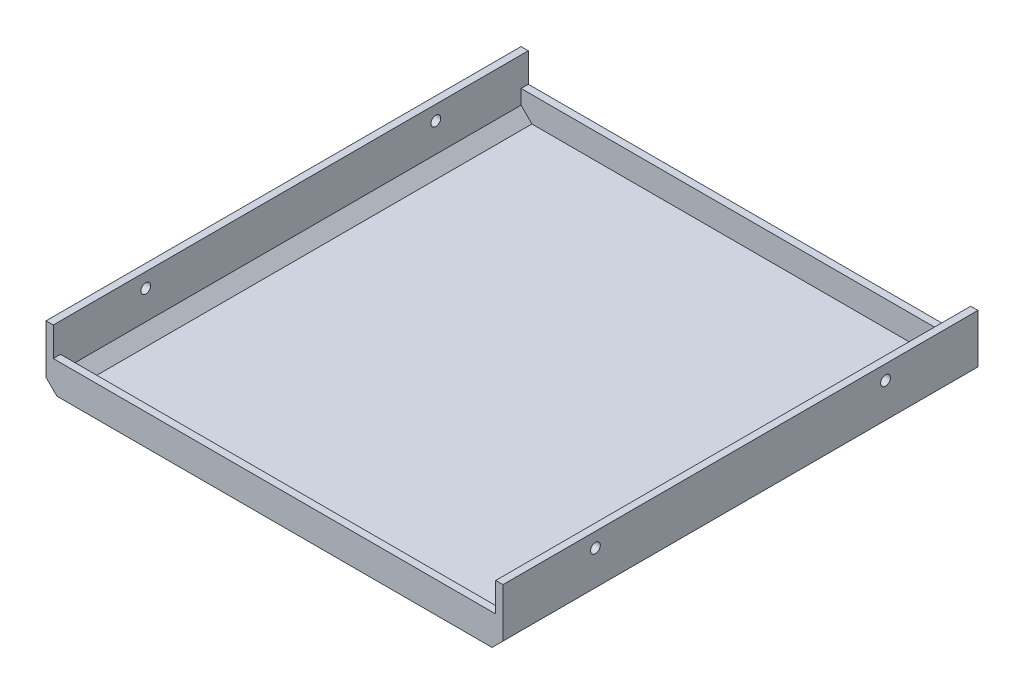
ISO-10303-21;
HEADER;
FILE_DESCRIPTION(('STEP AP214'),'2;1');
FILE_NAME('part.step','',(''),(''),'','','');
FILE_SCHEMA(('AUTOMOTIVE_DESIGN { 1 0 10303 214 1 1 1 1 }'));
ENDSEC;
DATA;
#1=APPLICATION_CONTEXT('core data for automotive mechanical design processes');
#2=APPLICATION_PROTOCOL_DEFINITION('international standard','automotive_design',2000,#1);
#3=PRODUCT_CONTEXT('',#1,'mechanical');
#4=PRODUCT('Part','Part','',(#3));
#5=PRODUCT_RELATED_PRODUCT_CATEGORY('part','',(#4));
#6=PRODUCT_DEFINITION_FORMATION('','',#4);
#7=PRODUCT_DEFINITION_CONTEXT('part definition',#1,'design');
#8=PRODUCT_DEFINITION('design','',#6,#7);
#9=PRODUCT_DEFINITION_SHAPE('','',#8);
#10=(LENGTH_UNIT() NAMED_UNIT(*) SI_UNIT(.MILLI.,.METRE.));
#11=(NAMED_UNIT(*) PLANE_ANGLE_UNIT() SI_UNIT($,.RADIAN.));
#12=(NAMED_UNIT(*) SI_UNIT($,.STERADIAN.) SOLID_ANGLE_UNIT());
#13=UNCERTAINTY_MEASURE_WITH_UNIT(LENGTH_MEASURE(1.E-05),#10,'distance_accuracy_value','');
#14=(GEOMETRIC_REPRESENTATION_CONTEXT(3) GLOBAL_UNCERTAINTY_ASSIGNED_CONTEXT((#13)) GLOBAL_UNIT_ASSIGNED_CONTEXT((#10,
#11,#12)) REPRESENTATION_CONTEXT('',''));
#15=CARTESIAN_POINT('',(0.,0.,0.));
#16=DIRECTION('',(0.,0.,1.));
#17=DIRECTION('',(1.,0.,0.));
#18=AXIS2_PLACEMENT_3D('',#15,#16,#17);
#19=CARTESIAN_POINT('',(0.,1.5,0.));
#20=DIRECTION('',(0.,1.,0.));
#21=DIRECTION('',(0.,0.,1.));
#22=AXIS2_PLACEMENT_3D('',#19,#20,#21);
#23=PLANE('',#22);
#24=DIRECTION('',(-1.,0.,0.));
#25=VECTOR('',#24,1.);
#26=CARTESIAN_POINT('',(61.,1.5,62.5));
#27=LINE('',#26,#25);
#28=CARTESIAN_POINT('',(58.,1.5,62.5));
#29=VERTEX_POINT('',#28);
#30=CARTESIAN_POINT('',(-57.9999999999999,1.5,62.5));
#31=VERTEX_POINT('',#30);
#32=EDGE_CURVE('E289',#29,#31,#27,.T.);
#33=ORIENTED_EDGE('',*,*,#32,.F.);
#34=DIRECTION('',(0.,0.,-1.));
#35=VECTOR('',#34,1.);
#36=CARTESIAN_POINT('',(58.,1.5,0.));
#37=LINE('',#36,#35);
#38=CARTESIAN_POINT('',(58.,1.5,-64.5));
#39=VERTEX_POINT('',#38);
#40=EDGE_CURVE('E59',#29,#39,#37,.T.);
#41=ORIENTED_EDGE('',*,*,#40,.T.);
#42=DIRECTION('',(1.,0.,0.));
#43=VECTOR('',#42,1.);
#44=CARTESIAN_POINT('',(-60.9999999999999,1.5,-64.5));
#45=LINE('',#44,#43);
#46=CARTESIAN_POINT('',(-57.9999999999999,1.5,-64.5));
#47=VERTEX_POINT('',#46);
#48=EDGE_CURVE('E171',#47,#39,#45,.T.);
#49=ORIENTED_EDGE('',*,*,#48,.F.);
#50=DIRECTION('',(0.,0.,1.));
#51=VECTOR('',#50,1.);
#52=CARTESIAN_POINT('',(-57.9999999999999,1.5,0.));
#53=LINE('',#52,#51);
#54=EDGE_CURVE('E276',#47,#31,#53,.T.);
#55=ORIENTED_EDGE('',*,*,#54,.T.);
#56=EDGE_LOOP('',(#33,#41,#49,#55));
#57=FACE_BOUND('',#56,.T.);
#58=ADVANCED_FACE('F36',(#57),#23,.T.);
#59=CARTESIAN_POINT('',(-60.9999999999999,16.5,-66.5));
#60=DIRECTION('',(-1.,0.,0.));
#61=DIRECTION('',(0.,0.,1.));
#62=AXIS2_PLACEMENT_3D('',#59,#60,#61);
#63=PLANE('',#62);
#64=CARTESIAN_POINT('',(-60.9999999999999,12.5,-41.));
#65=DIRECTION('',(-1.,0.,0.));
#66=DIRECTION('',(0.,0.,1.));
#67=AXIS2_PLACEMENT_3D('',#64,#65,#66);
#68=CIRCLE('',#67,1.35000000000001);
#69=CARTESIAN_POINT('',(-60.9999999999999,12.5,-39.65));
#70=VERTEX_POINT('',#69);
#71=EDGE_CURVE('E196',#70,#70,#68,.T.);
#72=ORIENTED_EDGE('',*,*,#71,.T.);
#73=EDGE_LOOP('',(#72));
#74=FACE_BOUND('',#73,.T.);
#75=CARTESIAN_POINT('',(-60.9999999999999,12.5,39.));
#76=DIRECTION('',(-1.,0.,0.));
#77=DIRECTION('',(0.,0.,1.));
#78=AXIS2_PLACEMENT_3D('',#75,#76,#77);
#79=CIRCLE('',#78,1.35000000000001);
#80=CARTESIAN_POINT('',(-60.9999999999999,12.5,40.35));
#81=VERTEX_POINT('',#80);
#82=EDGE_CURVE('E192',#81,#81,#79,.T.);
#83=ORIENTED_EDGE('',*,*,#82,.T.);
#84=EDGE_LOOP('',(#83));
#85=FACE_BOUND('',#84,.T.);
#86=DIRECTION('',(0.,-1.,0.));
#87=VECTOR('',#86,1.);
#88=CARTESIAN_POINT('',(-60.9999999999999,8.5,62.5));
#89=LINE('',#88,#87);
#90=CARTESIAN_POINT('',(-60.9999999999999,8.5,62.5));
#91=VERTEX_POINT('',#90);
#92=CARTESIAN_POINT('',(-60.9999999999999,4.50000000000003,62.5));
#93=VERTEX_POINT('',#92);
#94=EDGE_CURVE('E302',#91,#93,#89,.T.);
#95=ORIENTED_EDGE('',*,*,#94,.T.);
#96=DIRECTION('',(0.,0.,-1.));
#97=VECTOR('',#96,1.);
#98=CARTESIAN_POINT('',(-60.9999999999999,4.50000000000003,-66.5));
#99=LINE('',#98,#97);
#100=CARTESIAN_POINT('',(-60.9999999999999,4.50000000000003,-64.5));
#101=VERTEX_POINT('',#100);
#102=EDGE_CURVE('E11',#93,#101,#99,.T.);
#103=ORIENTED_EDGE('',*,*,#102,.T.);
#104=DIRECTION('',(0.,-1.,0.));
#105=VECTOR('',#104,1.);
#106=CARTESIAN_POINT('',(-60.9999999999999,8.5,-64.5));
#107=LINE('',#106,#105);
#108=CARTESIAN_POINT('',(-60.9999999999999,8.5,-64.5));
#109=VERTEX_POINT('',#108);
#110=EDGE_CURVE('E156',#109,#101,#107,.T.);
#111=ORIENTED_EDGE('',*,*,#110,.F.);
#112=DIRECTION('',(0.,0.,1.));
#113=VECTOR('',#112,1.);
#114=CARTESIAN_POINT('',(-60.9999999999999,8.5,-66.5));
#115=LINE('',#114,#113);
#116=CARTESIAN_POINT('',(-60.9999999999999,8.5,-66.5));
#117=VERTEX_POINT('',#116);
#118=EDGE_CURVE('E162',#117,#109,#115,.T.);
#119=ORIENTED_EDGE('',*,*,#118,.F.);
#120=DIRECTION('',(0.,-1.,0.));
#121=VECTOR('',#120,1.);
#122=CARTESIAN_POINT('',(-60.9999999999999,16.5,-66.5));
#123=LINE('',#122,#121);
#124=CARTESIAN_POINT('',(-60.9999999999999,16.5,-66.5));
#125=VERTEX_POINT('',#124);
#126=EDGE_CURVE('E225',#125,#117,#123,.T.);
#127=ORIENTED_EDGE('',*,*,#126,.F.);
#128=DIRECTION('',(0.,0.,-1.));
#129=VECTOR('',#128,1.);
#130=CARTESIAN_POINT('',(-60.9999999999999,16.5,-66.5));
#131=LINE('',#130,#129);
#132=CARTESIAN_POINT('',(-60.9999999999999,16.5,64.5));
#133=VERTEX_POINT('',#132);
#134=EDGE_CURVE('E220',#133,#125,#131,.T.);
#135=ORIENTED_EDGE('',*,*,#134,.F.);
#136=DIRECTION('',(0.,-1.,0.));
#137=VECTOR('',#136,1.);
#138=CARTESIAN_POINT('',(-60.9999999999999,16.5,64.5));
#139=LINE('',#138,#137);
#140=CARTESIAN_POINT('',(-60.9999999999999,8.5,64.5));
#141=VERTEX_POINT('',#140);
#142=EDGE_CURVE('E227',#133,#141,#139,.T.);
#143=ORIENTED_EDGE('',*,*,#142,.T.);
#144=DIRECTION('',(0.,0.,1.));
#145=VECTOR('',#144,1.);
#146=CARTESIAN_POINT('',(-60.9999999999999,8.5,64.5));
#147=LINE('',#146,#145);
#148=EDGE_CURVE('E344',#91,#141,#147,.T.);
#149=ORIENTED_EDGE('',*,*,#148,.F.);
#150=EDGE_LOOP('',(#95,#103,#111,#119,#127,#135,#143,#149));
#151=FACE_BOUND('',#150,.T.);
#152=ADVANCED_FACE('F174',(#74,#85,#151),#63,.F.);
#153=CARTESIAN_POINT('',(61.,16.5,64.5));
#154=DIRECTION('',(1.,0.,0.));
#155=DIRECTION('',(0.,0.,-1.));
#156=AXIS2_PLACEMENT_3D('',#153,#154,#155);
#157=PLANE('',#156);
#158=CARTESIAN_POINT('',(61.,12.5,-41.));
#159=DIRECTION('',(1.,0.,0.));
#160=DIRECTION('',(0.,0.,-1.));
#161=AXIS2_PLACEMENT_3D('',#158,#159,#160);
#162=CIRCLE('',#161,1.35000000000001);
#163=CARTESIAN_POINT('',(61.,12.5,-42.35));
#164=VERTEX_POINT('',#163);
#165=EDGE_CURVE('E195',#164,#164,#162,.T.);
#166=ORIENTED_EDGE('',*,*,#165,.T.);
#167=EDGE_LOOP('',(#166));
#168=FACE_BOUND('',#167,.T.);
#169=CARTESIAN_POINT('',(61.,12.5,39.));
#170=DIRECTION('',(1.,0.,0.));
#171=DIRECTION('',(0.,0.,-1.));
#172=AXIS2_PLACEMENT_3D('',#169,#170,#171);
#173=CIRCLE('',#172,1.35000000000001);
#174=CARTESIAN_POINT('',(61.,12.5,37.65));
#175=VERTEX_POINT('',#174);
#176=EDGE_CURVE('E188',#175,#175,#173,.T.);
#177=ORIENTED_EDGE('',*,*,#176,.T.);
#178=EDGE_LOOP('',(#177));
#179=FACE_BOUND('',#178,.T.);
#180=DIRECTION('',(0.,-1.,0.));
#181=VECTOR('',#180,1.);
#182=CARTESIAN_POINT('',(61.,8.5,-64.5));
#183=LINE('',#182,#181);
#184=CARTESIAN_POINT('',(61.,8.5,-64.5));
#185=VERTEX_POINT('',#184);
#186=CARTESIAN_POINT('',(61.,4.50000000000003,-64.5));
#187=VERTEX_POINT('',#186);
#188=EDGE_CURVE('E158',#185,#187,#183,.T.);
#189=ORIENTED_EDGE('',*,*,#188,.T.);
#190=DIRECTION('',(0.,0.,1.));
#191=VECTOR('',#190,1.);
#192=CARTESIAN_POINT('',(61.,4.50000000000003,64.5));
#193=LINE('',#192,#191);
#194=CARTESIAN_POINT('',(61.,4.50000000000003,62.5));
#195=VERTEX_POINT('',#194);
#196=EDGE_CURVE('E269',#187,#195,#193,.T.);
#197=ORIENTED_EDGE('',*,*,#196,.T.);
#198=DIRECTION('',(0.,-1.,0.));
#199=VECTOR('',#198,1.);
#200=CARTESIAN_POINT('',(61.,8.5,62.5));
#201=LINE('',#200,#199);
#202=CARTESIAN_POINT('',(61.,8.5,62.5));
#203=VERTEX_POINT('',#202);
#204=EDGE_CURVE('E292',#203,#195,#201,.T.);
#205=ORIENTED_EDGE('',*,*,#204,.F.);
#206=DIRECTION('',(0.,0.,-1.));
#207=VECTOR('',#206,1.);
#208=CARTESIAN_POINT('',(61.,8.5,64.5));
#209=LINE('',#208,#207);
#210=CARTESIAN_POINT('',(61.,8.5,64.5));
#211=VERTEX_POINT('',#210);
#212=EDGE_CURVE('E293',#211,#203,#209,.T.);
#213=ORIENTED_EDGE('',*,*,#212,.F.);
#214=DIRECTION('',(0.,-1.,0.));
#215=VECTOR('',#214,1.);
#216=CARTESIAN_POINT('',(61.,16.5,64.5));
#217=LINE('',#216,#215);
#218=CARTESIAN_POINT('',(61.,16.5,64.5));
#219=VERTEX_POINT('',#218);
#220=EDGE_CURVE('E209',#219,#211,#217,.T.);
#221=ORIENTED_EDGE('',*,*,#220,.F.);
#222=DIRECTION('',(0.,0.,1.));
#223=VECTOR('',#222,1.);
#224=CARTESIAN_POINT('',(61.,16.5,64.5));
#225=LINE('',#224,#223);
#226=CARTESIAN_POINT('',(61.,16.5,-66.5));
#227=VERTEX_POINT('',#226);
#228=EDGE_CURVE('E204',#227,#219,#225,.T.);
#229=ORIENTED_EDGE('',*,*,#228,.F.);
#230=DIRECTION('',(0.,-1.,0.));
#231=VECTOR('',#230,1.);
#232=CARTESIAN_POINT('',(61.,16.5,-66.5));
#233=LINE('',#232,#231);
#234=CARTESIAN_POINT('',(61.,8.5,-66.5));
#235=VERTEX_POINT('',#234);
#236=EDGE_CURVE('E212',#227,#235,#233,.T.);
#237=ORIENTED_EDGE('',*,*,#236,.T.);
#238=DIRECTION('',(0.,0.,-1.));
#239=VECTOR('',#238,1.);
#240=CARTESIAN_POINT('',(61.,8.5,-66.5));
#241=LINE('',#240,#239);
#242=EDGE_CURVE('E161',#185,#235,#241,.T.);
#243=ORIENTED_EDGE('',*,*,#242,.F.);
#244=EDGE_LOOP('',(#189,#197,#205,#213,#221,#229,#237,#243));
#245=FACE_BOUND('',#244,.T.);
#246=ADVANCED_FACE('F283',(#168,#179,#245),#157,.F.);
#247=CARTESIAN_POINT('',(-62.9999999999999,1.5,-66.5));
#248=DIRECTION('',(1.,0.,0.));
#249=DIRECTION('',(0.,0.,-1.));
#250=AXIS2_PLACEMENT_3D('',#247,#248,#249);
#251=PLANE('',#250);
#252=CARTESIAN_POINT('',(-62.9999999999999,12.5,-41.));
#253=DIRECTION('',(-1.,0.,0.));
#254=DIRECTION('',(0.,0.,1.));
#255=AXIS2_PLACEMENT_3D('',#252,#253,#254);
#256=CIRCLE('',#255,1.35000000000001);
#257=CARTESIAN_POINT('',(-62.9999999999999,12.5,-39.65));
#258=VERTEX_POINT('',#257);
#259=EDGE_CURVE('E183',#258,#258,#256,.T.);
#260=ORIENTED_EDGE('',*,*,#259,.F.);
#261=EDGE_LOOP('',(#260));
#262=FACE_BOUND('',#261,.T.);
#263=CARTESIAN_POINT('',(-62.9999999999999,12.5,39.));
#264=DIRECTION('',(-1.,0.,0.));
#265=DIRECTION('',(0.,0.,-1.));
#266=AXIS2_PLACEMENT_3D('',#263,#264,#265);
#267=CIRCLE('',#266,1.35000000000001);
#268=CARTESIAN_POINT('',(-62.9999999999999,12.5,37.65));
#269=VERTEX_POINT('',#268);
#270=EDGE_CURVE('E175',#269,#269,#267,.T.);
#271=ORIENTED_EDGE('',*,*,#270,.F.);
#272=EDGE_LOOP('',(#271));
#273=FACE_BOUND('',#272,.T.);
#274=DIRECTION('',(0.,-1.,0.));
#275=VECTOR('',#274,1.);
#276=CARTESIAN_POINT('',(-62.9999999999999,1.5,-66.5));
#277=LINE('',#276,#275);
#278=CARTESIAN_POINT('',(-62.9999999999999,16.5,-66.5));
#279=VERTEX_POINT('',#278);
#280=CARTESIAN_POINT('',(-62.9999999999999,3.,-66.5));
#281=VERTEX_POINT('',#280);
#282=EDGE_CURVE('E235',#279,#281,#277,.T.);
#283=ORIENTED_EDGE('',*,*,#282,.T.);
#284=DIRECTION('',(0.,0.,1.));
#285=VECTOR('',#284,1.);
#286=CARTESIAN_POINT('',(-62.9999999999999,3.,-66.5));
#287=LINE('',#286,#285);
#288=CARTESIAN_POINT('',(-62.9999999999999,3.,64.5));
#289=VERTEX_POINT('',#288);
#290=EDGE_CURVE('E247',#281,#289,#287,.T.);
#291=ORIENTED_EDGE('',*,*,#290,.T.);
#292=DIRECTION('',(0.,-1.,0.));
#293=VECTOR('',#292,1.);
#294=CARTESIAN_POINT('',(-62.9999999999999,1.5,64.5));
#295=LINE('',#294,#293);
#296=CARTESIAN_POINT('',(-62.9999999999999,16.5,64.5));
#297=VERTEX_POINT('',#296);
#298=EDGE_CURVE('E244',#297,#289,#295,.T.);
#299=ORIENTED_EDGE('',*,*,#298,.F.);
#300=DIRECTION('',(0.,0.,1.));
#301=VECTOR('',#300,1.);
#302=CARTESIAN_POINT('',(-62.9999999999999,16.5,-66.5));
#303=LINE('',#302,#301);
#304=EDGE_CURVE('E215',#279,#297,#303,.T.);
#305=ORIENTED_EDGE('',*,*,#304,.F.);
#306=EDGE_LOOP('',(#283,#291,#299,#305));
#307=FACE_BOUND('',#306,.T.);
#308=ADVANCED_FACE('F337',(#262,#273,#307),#251,.F.);
#309=CARTESIAN_POINT('',(-62.9999999999999,1.5,64.5));
#310=DIRECTION('',(0.,0.,-1.));
#311=DIRECTION('',(-1.,0.,0.));
#312=AXIS2_PLACEMENT_3D('',#309,#310,#311);
#313=PLANE('',#312);
#314=ORIENTED_EDGE('',*,*,#298,.T.);
#315=DIRECTION('',(-0.707106781186548,0.707106781186548,0.));
#316=VECTOR('',#315,1.);
#317=CARTESIAN_POINT('',(-62.9999999999999,3.00000000000002,64.5));
#318=LINE('',#317,#316);
#319=CARTESIAN_POINT('',(-59.9999999999999,0.,64.5));
#320=VERTEX_POINT('',#319);
#321=EDGE_CURVE('E256',#289,#320,#318,.F.);
#322=ORIENTED_EDGE('',*,*,#321,.T.);
#323=DIRECTION('',(1.,0.,0.));
#324=VECTOR('',#323,1.);
#325=CARTESIAN_POINT('',(-62.9999999999999,0.,64.5));
#326=LINE('',#325,#324);
#327=CARTESIAN_POINT('',(60.,0.,64.5));
#328=VERTEX_POINT('',#327);
#329=EDGE_CURVE('E229',#320,#328,#326,.T.);
#330=ORIENTED_EDGE('',*,*,#329,.T.);
#331=DIRECTION('',(-0.707106781186548,-0.707106781186548,0.));
#332=VECTOR('',#331,1.);
#333=CARTESIAN_POINT('',(63.,3.,64.5));
#334=LINE('',#333,#332);
#335=CARTESIAN_POINT('',(63.,3.,64.5));
#336=VERTEX_POINT('',#335);
#337=EDGE_CURVE('E254',#328,#336,#334,.F.);
#338=ORIENTED_EDGE('',*,*,#337,.T.);
#339=DIRECTION('',(0.,-1.,0.));
#340=VECTOR('',#339,1.);
#341=CARTESIAN_POINT('',(63.,1.5,64.5));
#342=LINE('',#341,#340);
#343=CARTESIAN_POINT('',(63.,16.5,64.5));
#344=VERTEX_POINT('',#343);
#345=EDGE_CURVE('E241',#344,#336,#342,.T.);
#346=ORIENTED_EDGE('',*,*,#345,.F.);
#347=DIRECTION('',(1.,0.,0.));
#348=VECTOR('',#347,1.);
#349=CARTESIAN_POINT('',(63.,16.5,64.5));
#350=LINE('',#349,#348);
#351=EDGE_CURVE('E206',#219,#344,#350,.T.);
#352=ORIENTED_EDGE('',*,*,#351,.F.);
#353=ORIENTED_EDGE('',*,*,#220,.T.);
#354=DIRECTION('',(1.,0.,0.));
#355=VECTOR('',#354,1.);
#356=CARTESIAN_POINT('',(61.,8.5,64.5));
#357=LINE('',#356,#355);
#358=EDGE_CURVE('E300',#141,#211,#357,.T.);
#359=ORIENTED_EDGE('',*,*,#358,.F.);
#360=ORIENTED_EDGE('',*,*,#142,.F.);
#361=DIRECTION('',(1.,0.,0.));
#362=VECTOR('',#361,1.);
#363=CARTESIAN_POINT('',(-62.9999999999999,16.5,64.5));
#364=LINE('',#363,#362);
#365=EDGE_CURVE('E218',#297,#133,#364,.T.);
#366=ORIENTED_EDGE('',*,*,#365,.F.);
#367=EDGE_LOOP('',(#314,#322,#330,#338,#346,#352,#353,#359,#360,#366));
#368=FACE_BOUND('',#367,.T.);
#369=ADVANCED_FACE('F330',(#368),#313,.F.);
#370=CARTESIAN_POINT('',(63.,1.5,-66.5));
#371=DIRECTION('',(-1.,0.,0.));
#372=DIRECTION('',(0.,0.,1.));
#373=AXIS2_PLACEMENT_3D('',#370,#371,#372);
#374=PLANE('',#373);
#375=CARTESIAN_POINT('',(63.,12.5,-41.));
#376=DIRECTION('',(-1.,0.,0.));
#377=DIRECTION('',(0.,0.,1.));
#378=AXIS2_PLACEMENT_3D('',#375,#376,#377);
#379=CIRCLE('',#378,1.35000000000001);
#380=CARTESIAN_POINT('',(63.,12.5,-39.65));
#381=VERTEX_POINT('',#380);
#382=EDGE_CURVE('E186',#381,#381,#379,.F.);
#383=ORIENTED_EDGE('',*,*,#382,.F.);
#384=EDGE_LOOP('',(#383));
#385=FACE_BOUND('',#384,.T.);
#386=CARTESIAN_POINT('',(63.,12.5,39.));
#387=DIRECTION('',(-1.,0.,0.));
#388=DIRECTION('',(0.,0.,1.));
#389=AXIS2_PLACEMENT_3D('',#386,#387,#388);
#390=CIRCLE('',#389,1.35000000000001);
#391=CARTESIAN_POINT('',(63.,12.5,40.35));
#392=VERTEX_POINT('',#391);
#393=EDGE_CURVE('E178',#392,#392,#390,.F.);
#394=ORIENTED_EDGE('',*,*,#393,.F.);
#395=EDGE_LOOP('',(#394));
#396=FACE_BOUND('',#395,.T.);
#397=ORIENTED_EDGE('',*,*,#345,.T.);
#398=DIRECTION('',(0.,0.,-1.));
#399=VECTOR('',#398,1.);
#400=CARTESIAN_POINT('',(63.,3.,-66.5));
#401=LINE('',#400,#399);
#402=CARTESIAN_POINT('',(63.,3.,-66.5));
#403=VERTEX_POINT('',#402);
#404=EDGE_CURVE('E266',#336,#403,#401,.T.);
#405=ORIENTED_EDGE('',*,*,#404,.T.);
#406=DIRECTION('',(0.,-1.,0.));
#407=VECTOR('',#406,1.);
#408=CARTESIAN_POINT('',(63.,1.5,-66.5));
#409=LINE('',#408,#407);
#410=CARTESIAN_POINT('',(63.,16.5,-66.5));
#411=VERTEX_POINT('',#410);
#412=EDGE_CURVE('E238',#411,#403,#409,.T.);
#413=ORIENTED_EDGE('',*,*,#412,.F.);
#414=DIRECTION('',(0.,0.,-1.));
#415=VECTOR('',#414,1.);
#416=CARTESIAN_POINT('',(63.,16.5,64.5));
#417=LINE('',#416,#415);
#418=EDGE_CURVE('E199',#344,#411,#417,.T.);
#419=ORIENTED_EDGE('',*,*,#418,.F.);
#420=EDGE_LOOP('',(#397,#405,#413,#419));
#421=FACE_BOUND('',#420,.T.);
#422=ADVANCED_FACE('F319',(#385,#396,#421),#374,.F.);
#423=CARTESIAN_POINT('',(-62.9999999999999,1.5,-66.5));
#424=DIRECTION('',(0.,0.,1.));
#425=DIRECTION('',(1.,0.,0.));
#426=AXIS2_PLACEMENT_3D('',#423,#424,#425);
#427=PLANE('',#426);
#428=DIRECTION('',(-1.,0.,0.));
#429=VECTOR('',#428,1.);
#430=CARTESIAN_POINT('',(-62.9999999999999,0.,-66.5));
#431=LINE('',#430,#429);
#432=CARTESIAN_POINT('',(60.,0.,-66.5));
#433=VERTEX_POINT('',#432);
#434=CARTESIAN_POINT('',(-59.9999999999999,0.,-66.5));
#435=VERTEX_POINT('',#434);
#436=EDGE_CURVE('E232',#433,#435,#431,.T.);
#437=ORIENTED_EDGE('',*,*,#436,.T.);
#438=DIRECTION('',(0.707106781186548,-0.707106781186548,0.));
#439=VECTOR('',#438,1.);
#440=CARTESIAN_POINT('',(-62.9999999999999,3.,-66.5));
#441=LINE('',#440,#439);
#442=EDGE_CURVE('E264',#435,#281,#441,.F.);
#443=ORIENTED_EDGE('',*,*,#442,.T.);
#444=ORIENTED_EDGE('',*,*,#282,.F.);
#445=DIRECTION('',(-1.,0.,0.));
#446=VECTOR('',#445,1.);
#447=CARTESIAN_POINT('',(-62.9999999999999,16.5,-66.5));
#448=LINE('',#447,#446);
#449=EDGE_CURVE('E222',#125,#279,#448,.T.);
#450=ORIENTED_EDGE('',*,*,#449,.F.);
#451=ORIENTED_EDGE('',*,*,#126,.T.);
#452=DIRECTION('',(-1.,0.,0.));
#453=VECTOR('',#452,1.);
#454=CARTESIAN_POINT('',(-60.9999999999999,8.5,-66.5));
#455=LINE('',#454,#453);
#456=EDGE_CURVE('E167',#235,#117,#455,.T.);
#457=ORIENTED_EDGE('',*,*,#456,.F.);
#458=ORIENTED_EDGE('',*,*,#236,.F.);
#459=DIRECTION('',(-1.,0.,0.));
#460=VECTOR('',#459,1.);
#461=CARTESIAN_POINT('',(63.,16.5,-66.5));
#462=LINE('',#461,#460);
#463=EDGE_CURVE('E202',#411,#227,#462,.T.);
#464=ORIENTED_EDGE('',*,*,#463,.F.);
#465=ORIENTED_EDGE('',*,*,#412,.T.);
#466=DIRECTION('',(0.707106781186548,0.707106781186548,0.));
#467=VECTOR('',#466,1.);
#468=CARTESIAN_POINT('',(63.,3.,-66.5));
#469=LINE('',#468,#467);
#470=EDGE_CURVE('E262',#403,#433,#469,.F.);
#471=ORIENTED_EDGE('',*,*,#470,.T.);
#472=EDGE_LOOP('',(#437,#443,#444,#450,#451,#457,#458,#464,#465,#471));
#473=FACE_BOUND('',#472,.T.);
#474=ADVANCED_FACE('F308',(#473),#427,.F.);
#475=CARTESIAN_POINT('',(0.,0.,0.));
#476=DIRECTION('',(0.,1.,0.));
#477=DIRECTION('',(0.,0.,1.));
#478=AXIS2_PLACEMENT_3D('',#475,#476,#477);
#479=PLANE('',#478);
#480=ORIENTED_EDGE('',*,*,#329,.F.);
#481=DIRECTION('',(0.,0.,-1.));
#482=VECTOR('',#481,1.);
#483=CARTESIAN_POINT('',(-59.9999999999999,0.,0.));
#484=LINE('',#483,#482);
#485=EDGE_CURVE('E260',#320,#435,#484,.T.);
#486=ORIENTED_EDGE('',*,*,#485,.T.);
#487=ORIENTED_EDGE('',*,*,#436,.F.);
#488=DIRECTION('',(0.,0.,1.));
#489=VECTOR('',#488,1.);
#490=CARTESIAN_POINT('',(60.,0.,0.));
#491=LINE('',#490,#489);
#492=EDGE_CURVE('E258',#433,#328,#491,.T.);
#493=ORIENTED_EDGE('',*,*,#492,.T.);
#494=EDGE_LOOP('',(#480,#486,#487,#493));
#495=FACE_BOUND('',#494,.T.);
#496=ADVANCED_FACE('F327',(#495),#479,.F.);
#497=CARTESIAN_POINT('',(0.,16.5,0.));
#498=DIRECTION('',(0.,1.,0.));
#499=DIRECTION('',(0.,0.,1.));
#500=AXIS2_PLACEMENT_3D('',#497,#498,#499);
#501=PLANE('',#500);
#502=ORIENTED_EDGE('',*,*,#304,.T.);
#503=ORIENTED_EDGE('',*,*,#365,.T.);
#504=ORIENTED_EDGE('',*,*,#134,.T.);
#505=ORIENTED_EDGE('',*,*,#449,.T.);
#506=EDGE_LOOP('',(#502,#503,#504,#505));
#507=FACE_BOUND('',#506,.T.);
#508=ADVANCED_FACE('F340',(#507),#501,.T.);
#509=CARTESIAN_POINT('',(0.,16.5,0.));
#510=DIRECTION('',(0.,1.,0.));
#511=DIRECTION('',(0.,0.,1.));
#512=AXIS2_PLACEMENT_3D('',#509,#510,#511);
#513=PLANE('',#512);
#514=ORIENTED_EDGE('',*,*,#418,.T.);
#515=ORIENTED_EDGE('',*,*,#463,.T.);
#516=ORIENTED_EDGE('',*,*,#228,.T.);
#517=ORIENTED_EDGE('',*,*,#351,.T.);
#518=EDGE_LOOP('',(#514,#515,#516,#517));
#519=FACE_BOUND('',#518,.T.);
#520=ADVANCED_FACE('F315',(#519),#513,.T.);
#521=CARTESIAN_POINT('',(66.8183766184074,12.5,39.));
#522=DIRECTION('',(-1.,0.,0.));
#523=DIRECTION('',(0.,0.,1.));
#524=AXIS2_PLACEMENT_3D('',#521,#522,#523);
#525=CYLINDRICAL_SURFACE('',#524,1.35000000000001);
#526=ORIENTED_EDGE('',*,*,#393,.T.);
#527=EDGE_LOOP('',(#526));
#528=FACE_BOUND('',#527,.T.);
#529=ORIENTED_EDGE('',*,*,#176,.F.);
#530=EDGE_LOOP('',(#529));
#531=FACE_BOUND('',#530,.T.);
#532=ADVANCED_FACE('F539',(#528,#531),#525,.F.);
#533=CARTESIAN_POINT('',(66.8183766184074,12.5,-41.));
#534=DIRECTION('',(-1.,0.,0.));
#535=DIRECTION('',(0.,0.,1.));
#536=AXIS2_PLACEMENT_3D('',#533,#534,#535);
#537=CYLINDRICAL_SURFACE('',#536,1.35000000000001);
#538=ORIENTED_EDGE('',*,*,#382,.T.);
#539=EDGE_LOOP('',(#538));
#540=FACE_BOUND('',#539,.T.);
#541=ORIENTED_EDGE('',*,*,#165,.F.);
#542=EDGE_LOOP('',(#541));
#543=FACE_BOUND('',#542,.T.);
#544=ADVANCED_FACE('F529',(#540,#543),#537,.F.);
#545=ORIENTED_EDGE('',*,*,#270,.T.);
#546=EDGE_LOOP('',(#545));
#547=FACE_BOUND('',#546,.T.);
#548=ORIENTED_EDGE('',*,*,#82,.F.);
#549=EDGE_LOOP('',(#548));
#550=FACE_BOUND('',#549,.T.);
#551=ADVANCED_FACE('F526',(#547,#550),#525,.F.);
#552=ORIENTED_EDGE('',*,*,#259,.T.);
#553=EDGE_LOOP('',(#552));
#554=FACE_BOUND('',#553,.T.);
#555=ORIENTED_EDGE('',*,*,#71,.F.);
#556=EDGE_LOOP('',(#555));
#557=FACE_BOUND('',#556,.T.);
#558=ADVANCED_FACE('F424',(#554,#557),#537,.F.);
#559=CARTESIAN_POINT('',(-60.9999999999999,8.5,-64.5));
#560=DIRECTION('',(0.,0.,-1.));
#561=DIRECTION('',(-1.,0.,0.));
#562=AXIS2_PLACEMENT_3D('',#559,#560,#561);
#563=PLANE('',#562);
#564=ORIENTED_EDGE('',*,*,#48,.T.);
#565=DIRECTION('',(0.707106781186544,0.707106781186551,0.));
#566=VECTOR('',#565,1.);
#567=CARTESIAN_POINT('',(61.,4.50000000000003,-64.5));
#568=LINE('',#567,#566);
#569=EDGE_CURVE('E45',#39,#187,#568,.T.);
#570=ORIENTED_EDGE('',*,*,#569,.T.);
#571=ORIENTED_EDGE('',*,*,#188,.F.);
#572=DIRECTION('',(1.,0.,0.));
#573=VECTOR('',#572,1.);
#574=CARTESIAN_POINT('',(-60.9999999999999,8.5,-64.5));
#575=LINE('',#574,#573);
#576=EDGE_CURVE('E152',#109,#185,#575,.T.);
#577=ORIENTED_EDGE('',*,*,#576,.F.);
#578=ORIENTED_EDGE('',*,*,#110,.T.);
#579=DIRECTION('',(0.707106781186544,-0.707106781186551,0.));
#580=VECTOR('',#579,1.);
#581=CARTESIAN_POINT('',(-60.9999999999999,4.50000000000003,-64.5));
#582=LINE('',#581,#580);
#583=EDGE_CURVE('E52',#101,#47,#582,.T.);
#584=ORIENTED_EDGE('',*,*,#583,.T.);
#585=EDGE_LOOP('',(#564,#570,#571,#577,#578,#584));
#586=FACE_BOUND('',#585,.T.);
#587=ADVANCED_FACE('F154',(#586),#563,.F.);
#588=CARTESIAN_POINT('',(0.,8.5,0.));
#589=DIRECTION('',(0.,1.,0.));
#590=DIRECTION('',(0.,0.,1.));
#591=AXIS2_PLACEMENT_3D('',#588,#589,#590);
#592=PLANE('',#591);
#593=ORIENTED_EDGE('',*,*,#118,.T.);
#594=ORIENTED_EDGE('',*,*,#576,.T.);
#595=ORIENTED_EDGE('',*,*,#242,.T.);
#596=ORIENTED_EDGE('',*,*,#456,.T.);
#597=EDGE_LOOP('',(#593,#594,#595,#596));
#598=FACE_BOUND('',#597,.T.);
#599=ADVANCED_FACE('F165',(#598),#592,.T.);
#600=CARTESIAN_POINT('',(61.,8.5,62.5));
#601=DIRECTION('',(0.,0.,1.));
#602=DIRECTION('',(1.,0.,0.));
#603=AXIS2_PLACEMENT_3D('',#600,#601,#602);
#604=PLANE('',#603);
#605=ORIENTED_EDGE('',*,*,#204,.T.);
#606=DIRECTION('',(-0.707106781186544,-0.707106781186551,0.));
#607=VECTOR('',#606,1.);
#608=CARTESIAN_POINT('',(61.,4.50000000000003,62.5));
#609=LINE('',#608,#607);
#610=EDGE_CURVE('E274',#195,#29,#609,.T.);
#611=ORIENTED_EDGE('',*,*,#610,.T.);
#612=ORIENTED_EDGE('',*,*,#32,.T.);
#613=DIRECTION('',(-0.707106781186544,0.707106781186551,0.));
#614=VECTOR('',#613,1.);
#615=CARTESIAN_POINT('',(-60.9999999999999,4.50000000000003,62.5));
#616=LINE('',#615,#614);
#617=EDGE_CURVE('E272',#31,#93,#616,.T.);
#618=ORIENTED_EDGE('',*,*,#617,.T.);
#619=ORIENTED_EDGE('',*,*,#94,.F.);
#620=DIRECTION('',(-1.,0.,0.));
#621=VECTOR('',#620,1.);
#622=CARTESIAN_POINT('',(61.,8.5,62.5));
#623=LINE('',#622,#621);
#624=EDGE_CURVE('E296',#203,#91,#623,.T.);
#625=ORIENTED_EDGE('',*,*,#624,.F.);
#626=EDGE_LOOP('',(#605,#611,#612,#618,#619,#625));
#627=FACE_BOUND('',#626,.T.);
#628=ADVANCED_FACE('F288',(#627),#604,.F.);
#629=CARTESIAN_POINT('',(0.,8.5,0.));
#630=DIRECTION('',(0.,1.,0.));
#631=DIRECTION('',(0.,0.,1.));
#632=AXIS2_PLACEMENT_3D('',#629,#630,#631);
#633=PLANE('',#632);
#634=ORIENTED_EDGE('',*,*,#212,.T.);
#635=ORIENTED_EDGE('',*,*,#624,.T.);
#636=ORIENTED_EDGE('',*,*,#148,.T.);
#637=ORIENTED_EDGE('',*,*,#358,.T.);
#638=EDGE_LOOP('',(#634,#635,#636,#637));
#639=FACE_BOUND('',#638,.T.);
#640=ADVANCED_FACE('F349',(#639),#633,.T.);
#641=CARTESIAN_POINT('',(-62.9999999999999,3.,-66.5));
#642=DIRECTION('',(0.707106781186547,0.707106781186547,0.));
#643=DIRECTION('',(0.,0.,1.));
#644=AXIS2_PLACEMENT_3D('',#641,#642,#643);
#645=PLANE('',#644);
#646=ORIENTED_EDGE('',*,*,#442,.F.);
#647=ORIENTED_EDGE('',*,*,#485,.F.);
#648=ORIENTED_EDGE('',*,*,#321,.F.);
#649=ORIENTED_EDGE('',*,*,#290,.F.);
#650=EDGE_LOOP('',(#646,#647,#648,#649));
#651=FACE_BOUND('',#650,.T.);
#652=ADVANCED_FACE('F335',(#651),#645,.F.);
#653=CARTESIAN_POINT('',(63.,3.,-66.5));
#654=DIRECTION('',(-0.707106781186547,0.707106781186547,0.));
#655=DIRECTION('',(0.,0.,-1.));
#656=AXIS2_PLACEMENT_3D('',#653,#654,#655);
#657=PLANE('',#656);
#658=ORIENTED_EDGE('',*,*,#337,.F.);
#659=ORIENTED_EDGE('',*,*,#492,.F.);
#660=ORIENTED_EDGE('',*,*,#470,.F.);
#661=ORIENTED_EDGE('',*,*,#404,.F.);
#662=EDGE_LOOP('',(#658,#659,#660,#661));
#663=FACE_BOUND('',#662,.T.);
#664=ADVANCED_FACE('F323',(#663),#657,.F.);
#665=CARTESIAN_POINT('',(61.,4.50000000000003,64.5));
#666=DIRECTION('',(0.707106781186551,-0.707106781186544,0.));
#667=DIRECTION('',(0.,0.,1.));
#668=AXIS2_PLACEMENT_3D('',#665,#666,#667);
#669=PLANE('',#668);
#670=ORIENTED_EDGE('',*,*,#569,.F.);
#671=ORIENTED_EDGE('',*,*,#40,.F.);
#672=ORIENTED_EDGE('',*,*,#610,.F.);
#673=ORIENTED_EDGE('',*,*,#196,.F.);
#674=EDGE_LOOP('',(#670,#671,#672,#673));
#675=FACE_BOUND('',#674,.T.);
#676=ADVANCED_FACE('F285',(#675),#669,.F.);
#677=CARTESIAN_POINT('',(-60.9999999999999,4.50000000000003,-66.5));
#678=DIRECTION('',(-0.707106781186551,-0.707106781186544,0.));
#679=DIRECTION('',(0.,0.,-1.));
#680=AXIS2_PLACEMENT_3D('',#677,#678,#679);
#681=PLANE('',#680);
#682=ORIENTED_EDGE('',*,*,#617,.F.);
#683=ORIENTED_EDGE('',*,*,#54,.F.);
#684=ORIENTED_EDGE('',*,*,#583,.F.);
#685=ORIENTED_EDGE('',*,*,#102,.F.);
#686=EDGE_LOOP('',(#682,#683,#684,#685));
#687=FACE_BOUND('',#686,.T.);
#688=ADVANCED_FACE('F39',(#687),#681,.F.);
#689=CLOSED_SHELL('',(#58,#152,#246,#308,#369,#422,#474,#496,#508,#520,#532,#544,#551,#558,#587,
#599,#628,#640,#652,#664,#676,#688));
#690=MANIFOLD_SOLID_BREP('B2',#689);
#691=ADVANCED_BREP_SHAPE_REPRESENTATION('',(#18,#690),#14);
#692=SHAPE_DEFINITION_REPRESENTATION(#9,#691);
ENDSEC;
END-ISO-10303-21;
